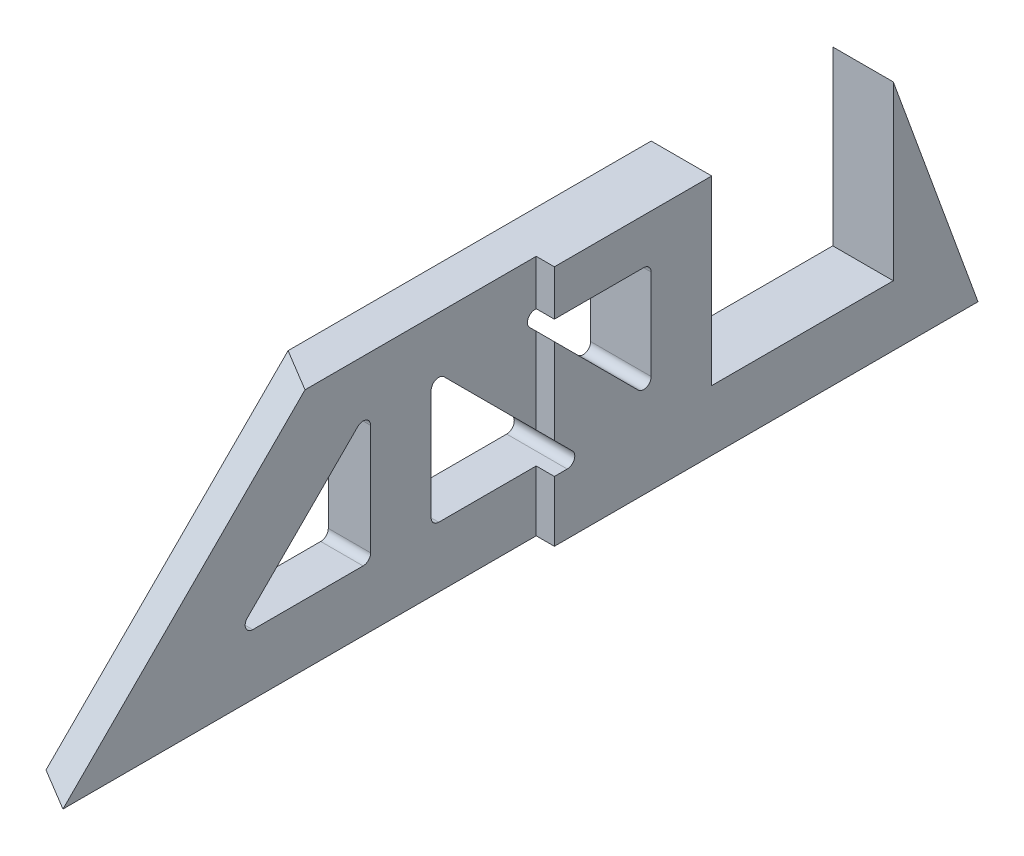
ISO-10303-21;
HEADER;
FILE_DESCRIPTION(('STEP AP214'),'2;1');
FILE_NAME('part.step','',(''),(''),'','','');
FILE_SCHEMA(('AUTOMOTIVE_DESIGN { 1 0 10303 214 1 1 1 1 }'));
ENDSEC;
DATA;
#1=APPLICATION_CONTEXT('core data for automotive mechanical design processes');
#2=APPLICATION_PROTOCOL_DEFINITION('international standard','automotive_design',2000,#1);
#3=PRODUCT_CONTEXT('',#1,'mechanical');
#4=PRODUCT('Part','Part','',(#3));
#5=PRODUCT_RELATED_PRODUCT_CATEGORY('part','',(#4));
#6=PRODUCT_DEFINITION_FORMATION('','',#4);
#7=PRODUCT_DEFINITION_CONTEXT('part definition',#1,'design');
#8=PRODUCT_DEFINITION('design','',#6,#7);
#9=PRODUCT_DEFINITION_SHAPE('','',#8);
#10=(LENGTH_UNIT() NAMED_UNIT(*) SI_UNIT(.MILLI.,.METRE.));
#11=(NAMED_UNIT(*) PLANE_ANGLE_UNIT() SI_UNIT($,.RADIAN.));
#12=(NAMED_UNIT(*) SI_UNIT($,.STERADIAN.) SOLID_ANGLE_UNIT());
#13=UNCERTAINTY_MEASURE_WITH_UNIT(LENGTH_MEASURE(1.E-05),#10,'distance_accuracy_value','');
#14=(GEOMETRIC_REPRESENTATION_CONTEXT(3) GLOBAL_UNCERTAINTY_ASSIGNED_CONTEXT((#13)) GLOBAL_UNIT_ASSIGNED_CONTEXT((#10,
#11,#12)) REPRESENTATION_CONTEXT('',''));
#15=CARTESIAN_POINT('',(0.,0.,0.));
#16=DIRECTION('',(0.,0.,1.));
#17=DIRECTION('',(1.,0.,0.));
#18=AXIS2_PLACEMENT_3D('',#15,#16,#17);
#19=CARTESIAN_POINT('',(8.89,0.,-6.34999999999998));
#20=DIRECTION('',(0.,0.,-1.));
#21=DIRECTION('',(0.,1.,0.));
#22=AXIS2_PLACEMENT_3D('',#19,#20,#21);
#23=PLANE('',#22);
#24=DIRECTION('',(0.,1.,0.));
#25=VECTOR('',#24,1.);
#26=CARTESIAN_POINT('',(8.89,0.,-6.34999999999998));
#27=LINE('',#26,#25);
#28=CARTESIAN_POINT('',(8.89,41.275,-6.34999999999998));
#29=VERTEX_POINT('',#28);
#30=CARTESIAN_POINT('',(8.89,50.8,-6.34999999999998));
#31=VERTEX_POINT('',#30);
#32=EDGE_CURVE('E464',#29,#31,#27,.T.);
#33=ORIENTED_EDGE('',*,*,#32,.F.);
#34=DIRECTION('',(-1.,0.,0.));
#35=VECTOR('',#34,1.);
#36=CARTESIAN_POINT('',(12.701,41.275,-6.34999999999998));
#37=LINE('',#36,#35);
#38=CARTESIAN_POINT('',(12.7,41.275,-6.34999999999998));
#39=VERTEX_POINT('',#38);
#40=EDGE_CURVE('E426',#39,#29,#37,.T.);
#41=ORIENTED_EDGE('',*,*,#40,.F.);
#42=DIRECTION('',(0.,1.,0.));
#43=VECTOR('',#42,1.);
#44=CARTESIAN_POINT('',(12.7,0.,-6.34999999999998));
#45=LINE('',#44,#43);
#46=CARTESIAN_POINT('',(12.7,50.8,-6.34999999999998));
#47=VERTEX_POINT('',#46);
#48=EDGE_CURVE('E265',#39,#47,#45,.T.);
#49=ORIENTED_EDGE('',*,*,#48,.T.);
#50=DIRECTION('',(1.,0.,0.));
#51=VECTOR('',#50,1.);
#52=CARTESIAN_POINT('',(8.89,50.8,-6.34999999999998));
#53=LINE('',#52,#51);
#54=EDGE_CURVE('E274',#31,#47,#53,.T.);
#55=ORIENTED_EDGE('',*,*,#54,.F.);
#56=EDGE_LOOP('',(#33,#41,#49,#55));
#57=FACE_BOUND('',#56,.T.);
#58=ADVANCED_FACE('F34',(#57),#23,.F.);
#59=CARTESIAN_POINT('',(12.7,19.2305122421383,-6.34999999999998));
#60=VERTEX_POINT('',#59);
#61=CARTESIAN_POINT('',(12.7,37.1910244842766,-6.34999999999998));
#62=VERTEX_POINT('',#61);
#63=EDGE_CURVE('E242',#60,#62,#45,.T.);
#64=ORIENTED_EDGE('',*,*,#63,.T.);
#65=DIRECTION('',(1.,0.,0.));
#66=VECTOR('',#65,1.);
#67=CARTESIAN_POINT('',(12.701,37.1910244842766,-6.34999999999998));
#68=LINE('',#67,#66);
#69=CARTESIAN_POINT('',(8.89,37.1910244842766,-6.34999999999998));
#70=VERTEX_POINT('',#69);
#71=EDGE_CURVE('E252',#70,#62,#68,.T.);
#72=ORIENTED_EDGE('',*,*,#71,.F.);
#73=CARTESIAN_POINT('',(8.89,19.2305122421383,-6.34999999999998));
#74=VERTEX_POINT('',#73);
#75=EDGE_CURVE('E468',#74,#70,#27,.T.);
#76=ORIENTED_EDGE('',*,*,#75,.F.);
#77=DIRECTION('',(-1.,0.,0.));
#78=VECTOR('',#77,1.);
#79=CARTESIAN_POINT('',(12.701,19.2305122421383,-6.34999999999998));
#80=LINE('',#79,#78);
#81=EDGE_CURVE('E263',#60,#74,#80,.T.);
#82=ORIENTED_EDGE('',*,*,#81,.F.);
#83=EDGE_LOOP('',(#64,#72,#76,#82));
#84=FACE_BOUND('',#83,.T.);
#85=ADVANCED_FACE('F262',(#84),#23,.F.);
#86=CARTESIAN_POINT('',(12.7,50.8,0.));
#87=DIRECTION('',(0.,1.,0.));
#88=DIRECTION('',(0.,0.,1.));
#89=AXIS2_PLACEMENT_3D('',#86,#87,#88);
#90=PLANE('',#89);
#91=ORIENTED_EDGE('',*,*,#54,.T.);
#92=DIRECTION('',(0.,0.,-1.));
#93=VECTOR('',#92,1.);
#94=CARTESIAN_POINT('',(12.7,50.8,0.));
#95=LINE('',#94,#93);
#96=CARTESIAN_POINT('',(12.7,50.8,-39.37));
#97=VERTEX_POINT('',#96);
#98=EDGE_CURVE('E285',#47,#97,#95,.T.);
#99=ORIENTED_EDGE('',*,*,#98,.T.);
#100=DIRECTION('',(-1.,0.,0.));
#101=VECTOR('',#100,1.);
#102=CARTESIAN_POINT('',(12.7,50.8,-39.37));
#103=LINE('',#102,#101);
#104=CARTESIAN_POINT('',(0.,50.8,-39.37));
#105=VERTEX_POINT('',#104);
#106=EDGE_CURVE('E302',#97,#105,#103,.T.);
#107=ORIENTED_EDGE('',*,*,#106,.T.);
#108=DIRECTION('',(0.,0.,-1.));
#109=VECTOR('',#108,1.);
#110=CARTESIAN_POINT('',(0.,50.8,0.));
#111=LINE('',#110,#109);
#112=CARTESIAN_POINT('',(0.,50.8,36.8299999999995));
#113=VERTEX_POINT('',#112);
#114=EDGE_CURVE('E284',#113,#105,#111,.T.);
#115=ORIENTED_EDGE('',*,*,#114,.F.);
#116=DIRECTION('',(-0.857492925712544,0.,-0.514495755427527));
#117=VECTOR('',#116,1.);
#118=CARTESIAN_POINT('',(-6.91029411764683,50.8,32.6838235294114));
#119=LINE('',#118,#117);
#120=CARTESIAN_POINT('',(8.89,50.8,42.1639999999995));
#121=VERTEX_POINT('',#120);
#122=EDGE_CURVE('E282',#121,#113,#119,.T.);
#123=ORIENTED_EDGE('',*,*,#122,.F.);
#124=DIRECTION('',(0.,0.,1.));
#125=VECTOR('',#124,1.);
#126=CARTESIAN_POINT('',(8.89,50.8,0.));
#127=LINE('',#126,#125);
#128=EDGE_CURVE('E268',#31,#121,#127,.T.);
#129=ORIENTED_EDGE('',*,*,#128,.F.);
#130=EDGE_LOOP('',(#91,#99,#107,#115,#123,#129));
#131=FACE_BOUND('',#130,.T.);
#132=ADVANCED_FACE('F534',(#131),#90,.T.);
#133=CARTESIAN_POINT('',(12.7,0.,0.));
#134=DIRECTION('',(0.,1.,0.));
#135=DIRECTION('',(0.,0.,1.));
#136=AXIS2_PLACEMENT_3D('',#133,#134,#135);
#137=PLANE('',#136);
#138=DIRECTION('',(0.,0.,-1.));
#139=VECTOR('',#138,1.);
#140=CARTESIAN_POINT('',(12.7,0.,0.));
#141=LINE('',#140,#139);
#142=CARTESIAN_POINT('',(12.7,0.,-6.34999999999998));
#143=VERTEX_POINT('',#142);
#144=CARTESIAN_POINT('',(12.7,0.,-95.25));
#145=VERTEX_POINT('',#144);
#146=EDGE_CURVE('E287',#143,#145,#141,.T.);
#147=ORIENTED_EDGE('',*,*,#146,.F.);
#148=DIRECTION('',(1.,0.,0.));
#149=VECTOR('',#148,1.);
#150=CARTESIAN_POINT('',(8.89,0.,-6.34999999999998));
#151=LINE('',#150,#149);
#152=CARTESIAN_POINT('',(8.89,0.,-6.34999999999998));
#153=VERTEX_POINT('',#152);
#154=EDGE_CURVE('E278',#153,#143,#151,.T.);
#155=ORIENTED_EDGE('',*,*,#154,.F.);
#156=DIRECTION('',(0.,0.,1.));
#157=VECTOR('',#156,1.);
#158=CARTESIAN_POINT('',(8.89,0.,0.));
#159=LINE('',#158,#157);
#160=CARTESIAN_POINT('',(8.89,0.,92.964));
#161=VERTEX_POINT('',#160);
#162=EDGE_CURVE('E462',#153,#161,#159,.T.);
#163=ORIENTED_EDGE('',*,*,#162,.T.);
#164=DIRECTION('',(0.857492925712544,0.,0.514495755427527));
#165=VECTOR('',#164,1.);
#166=CARTESIAN_POINT('',(12.7,0.,95.25));
#167=LINE('',#166,#165);
#168=CARTESIAN_POINT('',(0.,0.,87.63));
#169=VERTEX_POINT('',#168);
#170=EDGE_CURVE('E277',#169,#161,#167,.T.);
#171=ORIENTED_EDGE('',*,*,#170,.F.);
#172=DIRECTION('',(0.,0.,-1.));
#173=VECTOR('',#172,1.);
#174=CARTESIAN_POINT('',(0.,0.,0.));
#175=LINE('',#174,#173);
#176=CARTESIAN_POINT('',(0.,0.,-95.25));
#177=VERTEX_POINT('',#176);
#178=EDGE_CURVE('E304',#169,#177,#175,.T.);
#179=ORIENTED_EDGE('',*,*,#178,.T.);
#180=DIRECTION('',(-1.,0.,0.));
#181=VECTOR('',#180,1.);
#182=CARTESIAN_POINT('',(12.7,0.,-95.25));
#183=LINE('',#182,#181);
#184=EDGE_CURVE('E325',#145,#177,#183,.T.);
#185=ORIENTED_EDGE('',*,*,#184,.F.);
#186=EDGE_LOOP('',(#147,#155,#163,#171,#179,#185));
#187=FACE_BOUND('',#186,.T.);
#188=ADVANCED_FACE('F479',(#187),#137,.F.);
#189=CARTESIAN_POINT('',(12.7,30.6127599113217,-84.1078666035411));
#190=DIRECTION('',(0.,0.342020143325673,-0.939692620785907));
#191=DIRECTION('',(0.,0.939692620785907,0.342020143325673));
#192=AXIS2_PLACEMENT_3D('',#189,#190,#191);
#193=PLANE('',#192);
#194=DIRECTION('',(0.,-0.939692620785907,-0.342020143325673));
#195=VECTOR('',#194,1.);
#196=CARTESIAN_POINT('',(0.,30.6127599113217,-84.1078666035411));
#197=LINE('',#196,#195);
#198=CARTESIAN_POINT('',(0.,48.8501485179025,-77.47));
#199=VERTEX_POINT('',#198);
#200=EDGE_CURVE('E306',#199,#177,#197,.T.);
#201=ORIENTED_EDGE('',*,*,#200,.F.);
#202=DIRECTION('',(-1.,0.,0.));
#203=VECTOR('',#202,1.);
#204=CARTESIAN_POINT('',(12.7,48.8501485179025,-77.47));
#205=LINE('',#204,#203);
#206=CARTESIAN_POINT('',(12.7,48.8501485179025,-77.47));
#207=VERTEX_POINT('',#206);
#208=EDGE_CURVE('E323',#207,#199,#205,.T.);
#209=ORIENTED_EDGE('',*,*,#208,.F.);
#210=DIRECTION('',(0.,-0.939692620785907,-0.342020143325673));
#211=VECTOR('',#210,1.);
#212=CARTESIAN_POINT('',(12.7,30.6127599113217,-84.1078666035411));
#213=LINE('',#212,#211);
#214=EDGE_CURVE('E290',#207,#145,#213,.T.);
#215=ORIENTED_EDGE('',*,*,#214,.T.);
#216=ORIENTED_EDGE('',*,*,#184,.T.);
#217=EDGE_LOOP('',(#201,#209,#215,#216));
#218=FACE_BOUND('',#217,.T.);
#219=ADVANCED_FACE('F518',(#218),#193,.T.);
#220=CARTESIAN_POINT('',(12.7,0.,-77.47));
#221=DIRECTION('',(0.,0.,1.));
#222=DIRECTION('',(1.,0.,0.));
#223=AXIS2_PLACEMENT_3D('',#220,#221,#222);
#224=PLANE('',#223);
#225=DIRECTION('',(0.,1.,0.));
#226=VECTOR('',#225,1.);
#227=CARTESIAN_POINT('',(0.,0.,-77.47));
#228=LINE('',#227,#226);
#229=CARTESIAN_POINT('',(0.,12.7,-77.47));
#230=VERTEX_POINT('',#229);
#231=EDGE_CURVE('E309',#230,#199,#228,.T.);
#232=ORIENTED_EDGE('',*,*,#231,.F.);
#233=DIRECTION('',(-1.,0.,0.));
#234=VECTOR('',#233,1.);
#235=CARTESIAN_POINT('',(12.7,12.7,-77.47));
#236=LINE('',#235,#234);
#237=CARTESIAN_POINT('',(12.7,12.7,-77.47));
#238=VERTEX_POINT('',#237);
#239=EDGE_CURVE('E321',#238,#230,#236,.T.);
#240=ORIENTED_EDGE('',*,*,#239,.F.);
#241=DIRECTION('',(0.,1.,0.));
#242=VECTOR('',#241,1.);
#243=CARTESIAN_POINT('',(12.7,0.,-77.47));
#244=LINE('',#243,#242);
#245=EDGE_CURVE('E293',#238,#207,#244,.T.);
#246=ORIENTED_EDGE('',*,*,#245,.T.);
#247=ORIENTED_EDGE('',*,*,#208,.T.);
#248=EDGE_LOOP('',(#232,#240,#246,#247));
#249=FACE_BOUND('',#248,.T.);
#250=ADVANCED_FACE('F521',(#249),#224,.T.);
#251=CARTESIAN_POINT('',(12.7,12.7,0.));
#252=DIRECTION('',(0.,1.,0.));
#253=DIRECTION('',(0.,0.,1.));
#254=AXIS2_PLACEMENT_3D('',#251,#252,#253);
#255=PLANE('',#254);
#256=DIRECTION('',(0.,0.,-1.));
#257=VECTOR('',#256,1.);
#258=CARTESIAN_POINT('',(0.,12.7,0.));
#259=LINE('',#258,#257);
#260=CARTESIAN_POINT('',(0.,12.7,-39.37));
#261=VERTEX_POINT('',#260);
#262=EDGE_CURVE('E312',#261,#230,#259,.T.);
#263=ORIENTED_EDGE('',*,*,#262,.F.);
#264=DIRECTION('',(-1.,0.,0.));
#265=VECTOR('',#264,1.);
#266=CARTESIAN_POINT('',(12.7,12.7,-39.37));
#267=LINE('',#266,#265);
#268=CARTESIAN_POINT('',(12.7,12.7,-39.37));
#269=VERTEX_POINT('',#268);
#270=EDGE_CURVE('E319',#269,#261,#267,.T.);
#271=ORIENTED_EDGE('',*,*,#270,.F.);
#272=DIRECTION('',(0.,0.,-1.));
#273=VECTOR('',#272,1.);
#274=CARTESIAN_POINT('',(12.7,12.7,0.));
#275=LINE('',#274,#273);
#276=EDGE_CURVE('E296',#269,#238,#275,.T.);
#277=ORIENTED_EDGE('',*,*,#276,.T.);
#278=ORIENTED_EDGE('',*,*,#239,.T.);
#279=EDGE_LOOP('',(#263,#271,#277,#278));
#280=FACE_BOUND('',#279,.T.);
#281=ADVANCED_FACE('F526',(#280),#255,.T.);
#282=CARTESIAN_POINT('',(12.7,0.,-39.37));
#283=DIRECTION('',(0.,0.,-1.));
#284=DIRECTION('',(0.,1.,0.));
#285=AXIS2_PLACEMENT_3D('',#282,#283,#284);
#286=PLANE('',#285);
#287=DIRECTION('',(0.,-1.,0.));
#288=VECTOR('',#287,1.);
#289=CARTESIAN_POINT('',(0.,0.,-39.37));
#290=LINE('',#289,#288);
#291=EDGE_CURVE('E288',#105,#261,#290,.T.);
#292=ORIENTED_EDGE('',*,*,#291,.F.);
#293=ORIENTED_EDGE('',*,*,#106,.F.);
#294=DIRECTION('',(0.,-1.,0.));
#295=VECTOR('',#294,1.);
#296=CARTESIAN_POINT('',(12.7,0.,-39.37));
#297=LINE('',#296,#295);
#298=EDGE_CURVE('E299',#97,#269,#297,.T.);
#299=ORIENTED_EDGE('',*,*,#298,.T.);
#300=ORIENTED_EDGE('',*,*,#270,.T.);
#301=EDGE_LOOP('',(#292,#293,#299,#300));
#302=FACE_BOUND('',#301,.T.);
#303=ADVANCED_FACE('F529',(#302),#286,.T.);
#304=CARTESIAN_POINT('',(12.7,0.,0.));
#305=DIRECTION('',(1.,0.,0.));
#306=DIRECTION('',(0.,0.,-1.));
#307=AXIS2_PLACEMENT_3D('',#304,#305,#306);
#308=PLANE('',#307);
#309=DIRECTION('',(0.,0.,-1.));
#310=VECTOR('',#309,1.);
#311=CARTESIAN_POINT('',(12.7,41.275,-26.67));
#312=LINE('',#311,#310);
#313=CARTESIAN_POINT('',(12.7,41.275,-25.0825));
#314=VERTEX_POINT('',#313);
#315=EDGE_CURVE('E249',#39,#314,#312,.T.);
#316=ORIENTED_EDGE('',*,*,#315,.T.);
#317=CARTESIAN_POINT('',(12.7,39.6875,-25.0825));
#318=DIRECTION('',(1.,0.,0.));
#319=DIRECTION('',(0.,0.,-1.));
#320=AXIS2_PLACEMENT_3D('',#317,#318,#319);
#321=CIRCLE('',#320,1.5875);
#322=CARTESIAN_POINT('',(12.7,39.6875,-26.67));
#323=VERTEX_POINT('',#322);
#324=EDGE_CURVE('E405',#314,#323,#321,.F.);
#325=ORIENTED_EDGE('',*,*,#324,.T.);
#326=DIRECTION('',(0.,-1.,0.));
#327=VECTOR('',#326,1.);
#328=CARTESIAN_POINT('',(12.7,16.8710244842766,-26.67));
#329=LINE('',#328,#327);
#330=CARTESIAN_POINT('',(12.7,20.7035885145438,-26.67));
#331=VERTEX_POINT('',#330);
#332=EDGE_CURVE('E259',#323,#331,#329,.T.);
#333=ORIENTED_EDGE('',*,*,#332,.T.);
#334=CARTESIAN_POINT('',(12.7,20.7035885145438,-25.0825));
#335=DIRECTION('',(1.,0.,0.));
#336=DIRECTION('',(0.,0.,-1.));
#337=AXIS2_PLACEMENT_3D('',#334,#335,#336);
#338=CIRCLE('',#337,1.5875);
#339=CARTESIAN_POINT('',(12.7,19.5810564994102,-23.9599679848664));
#340=VERTEX_POINT('',#339);
#341=EDGE_CURVE('E245',#331,#340,#338,.F.);
#342=ORIENTED_EDGE('',*,*,#341,.T.);
#343=DIRECTION('',(0.,0.707106781186548,0.707106781186547));
#344=VECTOR('',#343,1.);
#345=CARTESIAN_POINT('',(12.7,41.275,-2.26602448427658));
#346=LINE('',#345,#344);
#347=EDGE_CURVE('E237',#340,#62,#346,.T.);
#348=ORIENTED_EDGE('',*,*,#347,.T.);
#349=ORIENTED_EDGE('',*,*,#63,.F.);
#350=DIRECTION('',(0.,-0.707106781186548,-0.707106781186548));
#351=VECTOR('',#350,1.);
#352=CARTESIAN_POINT('',(12.7,12.7,-12.8805122421383));
#353=LINE('',#352,#351);
#354=CARTESIAN_POINT('',(12.7,15.4100320151336,-10.1704802270046));
#355=VERTEX_POINT('',#354);
#356=EDGE_CURVE('E443',#60,#355,#353,.T.);
#357=ORIENTED_EDGE('',*,*,#356,.T.);
#358=CARTESIAN_POINT('',(12.7,14.2875,-9.04794821187098));
#359=DIRECTION('',(1.,0.,0.));
#360=DIRECTION('',(0.,0.,-1.));
#361=AXIS2_PLACEMENT_3D('',#358,#359,#360);
#362=CIRCLE('',#361,1.5875);
#363=CARTESIAN_POINT('',(12.7,12.7,-9.04794821187098));
#364=VERTEX_POINT('',#363);
#365=EDGE_CURVE('E399',#355,#364,#362,.F.);
#366=ORIENTED_EDGE('',*,*,#365,.T.);
#367=DIRECTION('',(0.,0.,1.));
#368=VECTOR('',#367,1.);
#369=CARTESIAN_POINT('',(12.7,12.7,15.6944877578617));
#370=LINE('',#369,#368);
#371=CARTESIAN_POINT('',(12.7,12.7,-6.34999999999998));
#372=VERTEX_POINT('',#371);
#373=EDGE_CURVE('E459',#364,#372,#370,.T.);
#374=ORIENTED_EDGE('',*,*,#373,.T.);
#375=EDGE_CURVE('E264',#143,#372,#45,.T.);
#376=ORIENTED_EDGE('',*,*,#375,.F.);
#377=ORIENTED_EDGE('',*,*,#146,.T.);
#378=ORIENTED_EDGE('',*,*,#214,.F.);
#379=ORIENTED_EDGE('',*,*,#245,.F.);
#380=ORIENTED_EDGE('',*,*,#276,.F.);
#381=ORIENTED_EDGE('',*,*,#298,.F.);
#382=ORIENTED_EDGE('',*,*,#98,.F.);
#383=ORIENTED_EDGE('',*,*,#48,.F.);
#384=EDGE_LOOP('',(#316,#325,#333,#342,#348,#349,#357,#366,#374,#376,#377,#378,#379,#380,#381,
#382,#383));
#385=FACE_BOUND('',#384,.T.);
#386=ADVANCED_FACE('F239',(#385),#308,.T.);
#387=CARTESIAN_POINT('',(0.,0.,0.));
#388=DIRECTION('',(1.,0.,0.));
#389=DIRECTION('',(0.,0.,-1.));
#390=AXIS2_PLACEMENT_3D('',#387,#388,#389);
#391=PLANE('',#390);
#392=DIRECTION('',(0.,0.707106781186548,-0.707106781186547));
#393=VECTOR('',#392,1.);
#394=CARTESIAN_POINT('',(0.,12.7,56.9694877578617));
#395=LINE('',#394,#393);
#396=CARTESIAN_POINT('',(0.,15.4100320151336,54.2594557427281));
#397=VERTEX_POINT('',#396);
#398=CARTESIAN_POINT('',(0.,38.5649679848663,31.1045197729954));
#399=VERTEX_POINT('',#398);
#400=EDGE_CURVE('E598',#397,#399,#395,.T.);
#401=ORIENTED_EDGE('',*,*,#400,.F.);
#402=CARTESIAN_POINT('',(0.,14.2875,53.1369237275944));
#403=DIRECTION('',(1.,0.,0.));
#404=DIRECTION('',(0.,0.,-1.));
#405=AXIS2_PLACEMENT_3D('',#402,#403,#404);
#406=CIRCLE('',#405,1.5875);
#407=CARTESIAN_POINT('',(0.,12.7,53.1369237275944));
#408=VERTEX_POINT('',#407);
#409=EDGE_CURVE('E377',#397,#408,#406,.T.);
#410=ORIENTED_EDGE('',*,*,#409,.T.);
#411=DIRECTION('',(0.,0.,1.));
#412=VECTOR('',#411,1.);
#413=CARTESIAN_POINT('',(0.,12.7,28.3944877578617));
#414=LINE('',#413,#412);
#415=CARTESIAN_POINT('',(0.,12.7,29.9819877578617));
#416=VERTEX_POINT('',#415);
#417=EDGE_CURVE('E603',#416,#408,#414,.T.);
#418=ORIENTED_EDGE('',*,*,#417,.F.);
#419=CARTESIAN_POINT('',(0.,14.2875,29.9819877578617));
#420=DIRECTION('',(1.,0.,0.));
#421=DIRECTION('',(0.,0.,-1.));
#422=AXIS2_PLACEMENT_3D('',#419,#420,#421);
#423=CIRCLE('',#422,1.5875);
#424=CARTESIAN_POINT('',(0.,14.2875,28.3944877578617));
#425=VERTEX_POINT('',#424);
#426=EDGE_CURVE('E393',#416,#425,#423,.T.);
#427=ORIENTED_EDGE('',*,*,#426,.T.);
#428=DIRECTION('',(0.,-1.,0.));
#429=VECTOR('',#428,1.);
#430=CARTESIAN_POINT('',(0.,41.275,28.3944877578617));
#431=LINE('',#430,#429);
#432=CARTESIAN_POINT('',(0.,37.4424359697327,28.3944877578617));
#433=VERTEX_POINT('',#432);
#434=EDGE_CURVE('E599',#433,#425,#431,.T.);
#435=ORIENTED_EDGE('',*,*,#434,.F.);
#436=CARTESIAN_POINT('',(0.,37.4424359697327,29.9819877578617));
#437=DIRECTION('',(1.,0.,0.));
#438=DIRECTION('',(0.,0.,-1.));
#439=AXIS2_PLACEMENT_3D('',#436,#437,#438);
#440=CIRCLE('',#439,1.5875);
#441=EDGE_CURVE('E389',#433,#399,#440,.T.);
#442=ORIENTED_EDGE('',*,*,#441,.T.);
#443=EDGE_LOOP('',(#401,#410,#418,#427,#435,#442));
#444=FACE_BOUND('',#443,.T.);
#445=DIRECTION('',(0.,-1.,0.));
#446=VECTOR('',#445,1.);
#447=CARTESIAN_POINT('',(0.,16.8710244842766,-26.67));
#448=LINE('',#447,#446);
#449=CARTESIAN_POINT('',(0.,39.6875,-26.67));
#450=VERTEX_POINT('',#449);
#451=CARTESIAN_POINT('',(0.,20.7035885145438,-26.67));
#452=VERTEX_POINT('',#451);
#453=EDGE_CURVE('E415',#450,#452,#448,.T.);
#454=ORIENTED_EDGE('',*,*,#453,.F.);
#455=CARTESIAN_POINT('',(0.,39.6875,-25.0825));
#456=DIRECTION('',(1.,0.,0.));
#457=DIRECTION('',(0.,0.,-1.));
#458=AXIS2_PLACEMENT_3D('',#455,#456,#457);
#459=CIRCLE('',#458,1.5875);
#460=CARTESIAN_POINT('',(0.,41.275,-25.0825));
#461=VERTEX_POINT('',#460);
#462=EDGE_CURVE('E57',#450,#461,#459,.T.);
#463=ORIENTED_EDGE('',*,*,#462,.T.);
#464=DIRECTION('',(0.,0.,-1.));
#465=VECTOR('',#464,1.);
#466=CARTESIAN_POINT('',(0.,41.275,-26.67));
#467=LINE('',#466,#465);
#468=CARTESIAN_POINT('',(0.,41.275,-6.09858851454387));
#469=VERTEX_POINT('',#468);
#470=EDGE_CURVE('E411',#469,#461,#467,.T.);
#471=ORIENTED_EDGE('',*,*,#470,.F.);
#472=CARTESIAN_POINT('',(0.,39.6875,-6.09858851454387));
#473=DIRECTION('',(1.,0.,0.));
#474=DIRECTION('',(0.,0.,-1.));
#475=AXIS2_PLACEMENT_3D('',#472,#473,#474);
#476=CIRCLE('',#475,1.5875);
#477=CARTESIAN_POINT('',(0.,38.5649679848663,-4.97605649941023));
#478=VERTEX_POINT('',#477);
#479=EDGE_CURVE('E42',#469,#478,#476,.T.);
#480=ORIENTED_EDGE('',*,*,#479,.T.);
#481=DIRECTION('',(0.,0.707106781186548,0.707106781186548));
#482=VECTOR('',#481,1.);
#483=CARTESIAN_POINT('',(0.,41.275,-2.26602448427658));
#484=LINE('',#483,#482);
#485=CARTESIAN_POINT('',(0.,19.5810564994102,-23.9599679848664));
#486=VERTEX_POINT('',#485);
#487=EDGE_CURVE('E410',#486,#478,#484,.T.);
#488=ORIENTED_EDGE('',*,*,#487,.F.);
#489=CARTESIAN_POINT('',(0.,20.7035885145438,-25.0825));
#490=DIRECTION('',(1.,0.,0.));
#491=DIRECTION('',(0.,0.,-1.));
#492=AXIS2_PLACEMENT_3D('',#489,#490,#491);
#493=CIRCLE('',#492,1.5875);
#494=EDGE_CURVE('E401',#486,#452,#493,.T.);
#495=ORIENTED_EDGE('',*,*,#494,.T.);
#496=EDGE_LOOP('',(#454,#463,#471,#480,#488,#495));
#497=FACE_BOUND('',#496,.T.);
#498=DIRECTION('',(0.,-0.707106781186547,-0.707106781186547));
#499=VECTOR('',#498,1.);
#500=CARTESIAN_POINT('',(0.,12.7,-12.8805122421383));
#501=LINE('',#500,#499);
#502=CARTESIAN_POINT('',(0.,38.5649679848663,12.9844557427281));
#503=VERTEX_POINT('',#502);
#504=CARTESIAN_POINT('',(0.,15.4100320151336,-10.1704802270046));
#505=VERTEX_POINT('',#504);
#506=EDGE_CURVE('E445',#503,#505,#501,.T.);
#507=ORIENTED_EDGE('',*,*,#506,.F.);
#508=CARTESIAN_POINT('',(0.,37.4424359697327,14.1069877578617));
#509=DIRECTION('',(1.,0.,0.));
#510=DIRECTION('',(0.,0.,-1.));
#511=AXIS2_PLACEMENT_3D('',#508,#509,#510);
#512=CIRCLE('',#511,1.5875);
#513=CARTESIAN_POINT('',(0.,37.4424359697327,15.6944877578617));
#514=VERTEX_POINT('',#513);
#515=EDGE_CURVE('E385',#503,#514,#512,.T.);
#516=ORIENTED_EDGE('',*,*,#515,.T.);
#517=DIRECTION('',(0.,1.,0.));
#518=VECTOR('',#517,1.);
#519=CARTESIAN_POINT('',(0.,41.275,15.6944877578617));
#520=LINE('',#519,#518);
#521=CARTESIAN_POINT('',(0.,14.2875,15.6944877578617));
#522=VERTEX_POINT('',#521);
#523=EDGE_CURVE('E451',#522,#514,#520,.T.);
#524=ORIENTED_EDGE('',*,*,#523,.F.);
#525=CARTESIAN_POINT('',(0.,14.2875,14.1069877578617));
#526=DIRECTION('',(1.,0.,0.));
#527=DIRECTION('',(0.,0.,-1.));
#528=AXIS2_PLACEMENT_3D('',#525,#526,#527);
#529=CIRCLE('',#528,1.5875);
#530=CARTESIAN_POINT('',(0.,12.7,14.1069877578617));
#531=VERTEX_POINT('',#530);
#532=EDGE_CURVE('E381',#522,#531,#529,.T.);
#533=ORIENTED_EDGE('',*,*,#532,.T.);
#534=DIRECTION('',(0.,0.,1.));
#535=VECTOR('',#534,1.);
#536=CARTESIAN_POINT('',(0.,12.7,15.6944877578617));
#537=LINE('',#536,#535);
#538=CARTESIAN_POINT('',(0.,12.7,-9.04794821187098));
#539=VERTEX_POINT('',#538);
#540=EDGE_CURVE('E448',#539,#531,#537,.T.);
#541=ORIENTED_EDGE('',*,*,#540,.F.);
#542=CARTESIAN_POINT('',(0.,14.2875,-9.04794821187098));
#543=DIRECTION('',(1.,0.,0.));
#544=DIRECTION('',(0.,0.,-1.));
#545=AXIS2_PLACEMENT_3D('',#542,#543,#544);
#546=CIRCLE('',#545,1.5875);
#547=EDGE_CURVE('E397',#539,#505,#546,.T.);
#548=ORIENTED_EDGE('',*,*,#547,.T.);
#549=EDGE_LOOP('',(#507,#516,#524,#533,#541,#548));
#550=FACE_BOUND('',#549,.T.);
#551=ORIENTED_EDGE('',*,*,#178,.F.);
#552=DIRECTION('',(0.,0.707106781186544,-0.707106781186551));
#553=VECTOR('',#552,1.);
#554=CARTESIAN_POINT('',(0.,43.815,43.8149999999995));
#555=LINE('',#554,#553);
#556=EDGE_CURVE('E328',#169,#113,#555,.T.);
#557=ORIENTED_EDGE('',*,*,#556,.T.);
#558=ORIENTED_EDGE('',*,*,#114,.T.);
#559=ORIENTED_EDGE('',*,*,#291,.T.);
#560=ORIENTED_EDGE('',*,*,#262,.T.);
#561=ORIENTED_EDGE('',*,*,#231,.T.);
#562=ORIENTED_EDGE('',*,*,#200,.T.);
#563=EDGE_LOOP('',(#551,#557,#558,#559,#560,#561,#562));
#564=FACE_BOUND('',#563,.T.);
#565=ADVANCED_FACE('F408',(#444,#497,#550,#564),#391,.F.);
#566=CARTESIAN_POINT('',(12.7,120.65,-25.400000000001));
#567=DIRECTION('',(0.39056673294247,-0.650944554904123,-0.650944554904116));
#568=DIRECTION('',(0.,0.707106781186544,-0.707106781186551));
#569=AXIS2_PLACEMENT_3D('',#566,#567,#568);
#570=PLANE('',#569);
#571=ORIENTED_EDGE('',*,*,#170,.T.);
#572=DIRECTION('',(0.,0.707106781186544,-0.707106781186551));
#573=VECTOR('',#572,1.);
#574=CARTESIAN_POINT('',(8.89,119.507,-26.543000000001));
#575=LINE('',#574,#573);
#576=EDGE_CURVE('E331',#161,#121,#575,.T.);
#577=ORIENTED_EDGE('',*,*,#576,.T.);
#578=ORIENTED_EDGE('',*,*,#122,.T.);
#579=ORIENTED_EDGE('',*,*,#556,.F.);
#580=EDGE_LOOP('',(#571,#577,#578,#579));
#581=FACE_BOUND('',#580,.T.);
#582=ADVANCED_FACE('F511',(#581),#570,.F.);
#583=CARTESIAN_POINT('',(8.89,0.,0.));
#584=DIRECTION('',(-1.,0.,0.));
#585=DIRECTION('',(0.,0.,1.));
#586=AXIS2_PLACEMENT_3D('',#583,#584,#585);
#587=PLANE('',#586);
#588=DIRECTION('',(0.,1.,0.));
#589=VECTOR('',#588,1.);
#590=CARTESIAN_POINT('',(8.89,41.275,28.3944877578617));
#591=LINE('',#590,#589);
#592=CARTESIAN_POINT('',(8.89,14.2875,28.3944877578617));
#593=VERTEX_POINT('',#592);
#594=CARTESIAN_POINT('',(8.89,37.4424359697327,28.3944877578617));
#595=VERTEX_POINT('',#594);
#596=EDGE_CURVE('E461',#593,#595,#591,.T.);
#597=ORIENTED_EDGE('',*,*,#596,.F.);
#598=CARTESIAN_POINT('',(8.89,14.2875,29.9819877578617));
#599=DIRECTION('',(-1.,0.,0.));
#600=DIRECTION('',(0.,0.,1.));
#601=AXIS2_PLACEMENT_3D('',#598,#599,#600);
#602=CIRCLE('',#601,1.5875);
#603=CARTESIAN_POINT('',(8.89,12.7,29.9819877578617));
#604=VERTEX_POINT('',#603);
#605=EDGE_CURVE('E395',#593,#604,#602,.T.);
#606=ORIENTED_EDGE('',*,*,#605,.T.);
#607=DIRECTION('',(0.,0.,-1.));
#608=VECTOR('',#607,1.);
#609=CARTESIAN_POINT('',(8.89,12.7,28.3944877578617));
#610=LINE('',#609,#608);
#611=CARTESIAN_POINT('',(8.89,12.7,53.1369237275944));
#612=VERTEX_POINT('',#611);
#613=EDGE_CURVE('E590',#612,#604,#610,.T.);
#614=ORIENTED_EDGE('',*,*,#613,.F.);
#615=CARTESIAN_POINT('',(8.89,14.2875,53.1369237275944));
#616=DIRECTION('',(-1.,0.,0.));
#617=DIRECTION('',(0.,0.,1.));
#618=AXIS2_PLACEMENT_3D('',#615,#616,#617);
#619=CIRCLE('',#618,1.5875);
#620=CARTESIAN_POINT('',(8.89,15.4100320151336,54.2594557427281));
#621=VERTEX_POINT('',#620);
#622=EDGE_CURVE('E379',#612,#621,#619,.T.);
#623=ORIENTED_EDGE('',*,*,#622,.T.);
#624=DIRECTION('',(0.,-0.707106781186548,0.707106781186547));
#625=VECTOR('',#624,1.);
#626=CARTESIAN_POINT('',(8.89,12.7,56.9694877578617));
#627=LINE('',#626,#625);
#628=CARTESIAN_POINT('',(8.89,38.5649679848663,31.1045197729954));
#629=VERTEX_POINT('',#628);
#630=EDGE_CURVE('E269',#629,#621,#627,.T.);
#631=ORIENTED_EDGE('',*,*,#630,.F.);
#632=CARTESIAN_POINT('',(8.89,37.4424359697327,29.9819877578617));
#633=DIRECTION('',(-1.,0.,0.));
#634=DIRECTION('',(0.,0.,1.));
#635=AXIS2_PLACEMENT_3D('',#632,#633,#634);
#636=CIRCLE('',#635,1.5875);
#637=EDGE_CURVE('E391',#629,#595,#636,.T.);
#638=ORIENTED_EDGE('',*,*,#637,.T.);
#639=EDGE_LOOP('',(#597,#606,#614,#623,#631,#638));
#640=FACE_BOUND('',#639,.T.);
#641=DIRECTION('',(0.,-0.707106781186548,-0.707106781186547));
#642=VECTOR('',#641,1.);
#643=CARTESIAN_POINT('',(8.89,41.275,-2.26602448427658));
#644=LINE('',#643,#642);
#645=CARTESIAN_POINT('',(8.89,38.5649679848663,-4.97605649941023));
#646=VERTEX_POINT('',#645);
#647=EDGE_CURVE('E255',#646,#70,#644,.T.);
#648=ORIENTED_EDGE('',*,*,#647,.F.);
#649=CARTESIAN_POINT('',(8.89,39.6875,-6.09858851454387));
#650=DIRECTION('',(-1.,0.,0.));
#651=DIRECTION('',(0.,0.,1.));
#652=AXIS2_PLACEMENT_3D('',#649,#650,#651);
#653=CIRCLE('',#652,1.5875);
#654=CARTESIAN_POINT('',(8.89,41.275,-6.09858851454387));
#655=VERTEX_POINT('',#654);
#656=EDGE_CURVE('E11',#646,#655,#653,.T.);
#657=ORIENTED_EDGE('',*,*,#656,.T.);
#658=DIRECTION('',(0.,0.,1.));
#659=VECTOR('',#658,1.);
#660=CARTESIAN_POINT('',(8.89,41.275,-26.67));
#661=LINE('',#660,#659);
#662=EDGE_CURVE('E422',#29,#655,#661,.T.);
#663=ORIENTED_EDGE('',*,*,#662,.F.);
#664=ORIENTED_EDGE('',*,*,#32,.T.);
#665=ORIENTED_EDGE('',*,*,#128,.T.);
#666=ORIENTED_EDGE('',*,*,#576,.F.);
#667=ORIENTED_EDGE('',*,*,#162,.F.);
#668=CARTESIAN_POINT('',(8.89,12.7,-6.34999999999998));
#669=VERTEX_POINT('',#668);
#670=EDGE_CURVE('E272',#153,#669,#27,.T.);
#671=ORIENTED_EDGE('',*,*,#670,.T.);
#672=DIRECTION('',(0.,0.,-1.));
#673=VECTOR('',#672,1.);
#674=CARTESIAN_POINT('',(8.89,12.7,15.6944877578617));
#675=LINE('',#674,#673);
#676=CARTESIAN_POINT('',(8.89,12.7,14.1069877578617));
#677=VERTEX_POINT('',#676);
#678=EDGE_CURVE('E457',#677,#669,#675,.T.);
#679=ORIENTED_EDGE('',*,*,#678,.F.);
#680=CARTESIAN_POINT('',(8.89,14.2875,14.1069877578617));
#681=DIRECTION('',(-1.,0.,0.));
#682=DIRECTION('',(0.,0.,1.));
#683=AXIS2_PLACEMENT_3D('',#680,#681,#682);
#684=CIRCLE('',#683,1.5875);
#685=CARTESIAN_POINT('',(8.89,14.2875,15.6944877578617));
#686=VERTEX_POINT('',#685);
#687=EDGE_CURVE('E383',#677,#686,#684,.T.);
#688=ORIENTED_EDGE('',*,*,#687,.T.);
#689=DIRECTION('',(0.,-1.,0.));
#690=VECTOR('',#689,1.);
#691=CARTESIAN_POINT('',(8.89,41.275,15.6944877578617));
#692=LINE('',#691,#690);
#693=CARTESIAN_POINT('',(8.89,37.4424359697327,15.6944877578617));
#694=VERTEX_POINT('',#693);
#695=EDGE_CURVE('E437',#694,#686,#692,.T.);
#696=ORIENTED_EDGE('',*,*,#695,.F.);
#697=CARTESIAN_POINT('',(8.89,37.4424359697327,14.1069877578617));
#698=DIRECTION('',(-1.,0.,0.));
#699=DIRECTION('',(0.,0.,1.));
#700=AXIS2_PLACEMENT_3D('',#697,#698,#699);
#701=CIRCLE('',#700,1.5875);
#702=CARTESIAN_POINT('',(8.89,38.5649679848663,12.9844557427281));
#703=VERTEX_POINT('',#702);
#704=EDGE_CURVE('E387',#694,#703,#701,.T.);
#705=ORIENTED_EDGE('',*,*,#704,.T.);
#706=DIRECTION('',(0.,0.707106781186548,0.707106781186548));
#707=VECTOR('',#706,1.);
#708=CARTESIAN_POINT('',(8.89,12.7,-12.8805122421383));
#709=LINE('',#708,#707);
#710=EDGE_CURVE('E440',#74,#703,#709,.T.);
#711=ORIENTED_EDGE('',*,*,#710,.F.);
#712=ORIENTED_EDGE('',*,*,#75,.T.);
#713=EDGE_LOOP('',(#648,#657,#663,#664,#665,#666,#667,#671,#679,#688,#696,#705,#711,#712));
#714=FACE_BOUND('',#713,.T.);
#715=ADVANCED_FACE('F421',(#640,#714),#587,.F.);
#716=ORIENTED_EDGE('',*,*,#375,.T.);
#717=DIRECTION('',(1.,0.,0.));
#718=VECTOR('',#717,1.);
#719=CARTESIAN_POINT('',(12.701,12.7,-6.34999999999998));
#720=LINE('',#719,#718);
#721=EDGE_CURVE('E454',#669,#372,#720,.T.);
#722=ORIENTED_EDGE('',*,*,#721,.F.);
#723=ORIENTED_EDGE('',*,*,#670,.F.);
#724=ORIENTED_EDGE('',*,*,#154,.T.);
#725=EDGE_LOOP('',(#716,#722,#723,#724));
#726=FACE_BOUND('',#725,.T.);
#727=ADVANCED_FACE('F476',(#726),#23,.F.);
#728=CARTESIAN_POINT('',(12.701,41.275,15.6944877578617));
#729=DIRECTION('',(0.,0.,1.));
#730=DIRECTION('',(0.,-1.,0.));
#731=AXIS2_PLACEMENT_3D('',#728,#729,#730);
#732=PLANE('',#731);
#733=ORIENTED_EDGE('',*,*,#695,.T.);
#734=DIRECTION('',(-1.,0.,0.));
#735=VECTOR('',#734,1.);
#736=CARTESIAN_POINT('',(0.,14.2875,15.6944877578617));
#737=LINE('',#736,#735);
#738=EDGE_CURVE('E346',#686,#522,#737,.T.);
#739=ORIENTED_EDGE('',*,*,#738,.T.);
#740=ORIENTED_EDGE('',*,*,#523,.T.);
#741=DIRECTION('',(-1.,0.,0.));
#742=VECTOR('',#741,1.);
#743=CARTESIAN_POINT('',(8.89,37.4424359697327,15.6944877578617));
#744=LINE('',#743,#742);
#745=EDGE_CURVE('E344',#514,#694,#744,.F.);
#746=ORIENTED_EDGE('',*,*,#745,.T.);
#747=EDGE_LOOP('',(#733,#739,#740,#746));
#748=FACE_BOUND('',#747,.T.);
#749=ADVANCED_FACE('F496',(#748),#732,.F.);
#750=CARTESIAN_POINT('',(12.701,12.7,-12.8805122421383));
#751=DIRECTION('',(0.,0.707106781186548,-0.707106781186548));
#752=DIRECTION('',(0.,0.707106781186548,0.707106781186548));
#753=AXIS2_PLACEMENT_3D('',#750,#751,#752);
#754=PLANE('',#753);
#755=ORIENTED_EDGE('',*,*,#710,.T.);
#756=DIRECTION('',(-1.,0.,0.));
#757=VECTOR('',#756,1.);
#758=CARTESIAN_POINT('',(0.,38.5649679848663,12.9844557427281));
#759=LINE('',#758,#757);
#760=EDGE_CURVE('E356',#703,#503,#759,.T.);
#761=ORIENTED_EDGE('',*,*,#760,.T.);
#762=ORIENTED_EDGE('',*,*,#506,.T.);
#763=DIRECTION('',(-1.,0.,0.));
#764=VECTOR('',#763,1.);
#765=CARTESIAN_POINT('',(12.7,15.4100320151336,-10.1704802270046));
#766=LINE('',#765,#764);
#767=EDGE_CURVE('E354',#505,#355,#766,.F.);
#768=ORIENTED_EDGE('',*,*,#767,.T.);
#769=ORIENTED_EDGE('',*,*,#356,.F.);
#770=ORIENTED_EDGE('',*,*,#81,.T.);
#771=EDGE_LOOP('',(#755,#761,#762,#768,#769,#770));
#772=FACE_BOUND('',#771,.T.);
#773=ADVANCED_FACE('F504',(#772),#754,.F.);
#774=CARTESIAN_POINT('',(12.701,12.7,15.6944877578617));
#775=DIRECTION('',(0.,-1.,0.));
#776=DIRECTION('',(0.,0.,-1.));
#777=AXIS2_PLACEMENT_3D('',#774,#775,#776);
#778=PLANE('',#777);
#779=ORIENTED_EDGE('',*,*,#540,.T.);
#780=DIRECTION('',(-1.,0.,0.));
#781=VECTOR('',#780,1.);
#782=CARTESIAN_POINT('',(8.89,12.7,14.1069877578617));
#783=LINE('',#782,#781);
#784=EDGE_CURVE('E352',#531,#677,#783,.F.);
#785=ORIENTED_EDGE('',*,*,#784,.T.);
#786=ORIENTED_EDGE('',*,*,#678,.T.);
#787=ORIENTED_EDGE('',*,*,#721,.T.);
#788=ORIENTED_EDGE('',*,*,#373,.F.);
#789=DIRECTION('',(-1.,0.,0.));
#790=VECTOR('',#789,1.);
#791=CARTESIAN_POINT('',(0.,12.7,-9.04794821187098));
#792=LINE('',#791,#790);
#793=EDGE_CURVE('E349',#364,#539,#792,.T.);
#794=ORIENTED_EDGE('',*,*,#793,.T.);
#795=EDGE_LOOP('',(#779,#785,#786,#787,#788,#794));
#796=FACE_BOUND('',#795,.T.);
#797=ADVANCED_FACE('F487',(#796),#778,.F.);
#798=CARTESIAN_POINT('',(12.701,41.275,-26.67));
#799=DIRECTION('',(0.,1.,0.));
#800=DIRECTION('',(0.,0.,1.));
#801=AXIS2_PLACEMENT_3D('',#798,#799,#800);
#802=PLANE('',#801);
#803=ORIENTED_EDGE('',*,*,#470,.T.);
#804=DIRECTION('',(-1.,0.,0.));
#805=VECTOR('',#804,1.);
#806=CARTESIAN_POINT('',(12.7,41.275,-25.0825));
#807=LINE('',#806,#805);
#808=EDGE_CURVE('E49',#461,#314,#807,.F.);
#809=ORIENTED_EDGE('',*,*,#808,.T.);
#810=ORIENTED_EDGE('',*,*,#315,.F.);
#811=ORIENTED_EDGE('',*,*,#40,.T.);
#812=ORIENTED_EDGE('',*,*,#662,.T.);
#813=DIRECTION('',(-1.,0.,0.));
#814=VECTOR('',#813,1.);
#815=CARTESIAN_POINT('',(0.,41.275,-6.09858851454387));
#816=LINE('',#815,#814);
#817=EDGE_CURVE('E373',#655,#469,#816,.T.);
#818=ORIENTED_EDGE('',*,*,#817,.T.);
#819=EDGE_LOOP('',(#803,#809,#810,#811,#812,#818));
#820=FACE_BOUND('',#819,.T.);
#821=ADVANCED_FACE('F424',(#820),#802,.F.);
#822=CARTESIAN_POINT('',(12.701,41.275,-2.26602448427658));
#823=DIRECTION('',(0.,-0.707106781186547,0.707106781186548));
#824=DIRECTION('',(0.,-0.707106781186548,-0.707106781186547));
#825=AXIS2_PLACEMENT_3D('',#822,#823,#824);
#826=PLANE('',#825);
#827=ORIENTED_EDGE('',*,*,#347,.F.);
#828=DIRECTION('',(-1.,0.,0.));
#829=VECTOR('',#828,1.);
#830=CARTESIAN_POINT('',(0.,19.5810564994102,-23.9599679848664));
#831=LINE('',#830,#829);
#832=EDGE_CURVE('E366',#340,#486,#831,.T.);
#833=ORIENTED_EDGE('',*,*,#832,.T.);
#834=ORIENTED_EDGE('',*,*,#487,.T.);
#835=DIRECTION('',(-1.,0.,0.));
#836=VECTOR('',#835,1.);
#837=CARTESIAN_POINT('',(8.89,38.5649679848663,-4.97605649941023));
#838=LINE('',#837,#836);
#839=EDGE_CURVE('E364',#478,#646,#838,.F.);
#840=ORIENTED_EDGE('',*,*,#839,.T.);
#841=ORIENTED_EDGE('',*,*,#647,.T.);
#842=ORIENTED_EDGE('',*,*,#71,.T.);
#843=EDGE_LOOP('',(#827,#833,#834,#840,#841,#842));
#844=FACE_BOUND('',#843,.T.);
#845=ADVANCED_FACE('F253',(#844),#826,.F.);
#846=CARTESIAN_POINT('',(12.701,16.8710244842766,-26.67));
#847=DIRECTION('',(0.,0.,-1.));
#848=DIRECTION('',(-1.,0.,0.));
#849=AXIS2_PLACEMENT_3D('',#846,#847,#848);
#850=PLANE('',#849);
#851=ORIENTED_EDGE('',*,*,#453,.T.);
#852=DIRECTION('',(-1.,0.,0.));
#853=VECTOR('',#852,1.);
#854=CARTESIAN_POINT('',(12.7,20.7035885145438,-26.67));
#855=LINE('',#854,#853);
#856=EDGE_CURVE('E371',#452,#331,#855,.F.);
#857=ORIENTED_EDGE('',*,*,#856,.T.);
#858=ORIENTED_EDGE('',*,*,#332,.F.);
#859=DIRECTION('',(-1.,0.,0.));
#860=VECTOR('',#859,1.);
#861=CARTESIAN_POINT('',(0.,39.6875,-26.67));
#862=LINE('',#861,#860);
#863=EDGE_CURVE('E368',#323,#450,#862,.T.);
#864=ORIENTED_EDGE('',*,*,#863,.T.);
#865=EDGE_LOOP('',(#851,#857,#858,#864));
#866=FACE_BOUND('',#865,.T.);
#867=ADVANCED_FACE('F564',(#866),#850,.F.);
#868=CARTESIAN_POINT('',(12.701,12.7,28.3944877578617));
#869=DIRECTION('',(0.,-1.,0.));
#870=DIRECTION('',(0.,0.,-1.));
#871=AXIS2_PLACEMENT_3D('',#868,#869,#870);
#872=PLANE('',#871);
#873=ORIENTED_EDGE('',*,*,#417,.T.);
#874=DIRECTION('',(-1.,0.,0.));
#875=VECTOR('',#874,1.);
#876=CARTESIAN_POINT('',(8.89,12.7,53.1369237275944));
#877=LINE('',#876,#875);
#878=EDGE_CURVE('E342',#408,#612,#877,.F.);
#879=ORIENTED_EDGE('',*,*,#878,.T.);
#880=ORIENTED_EDGE('',*,*,#613,.T.);
#881=DIRECTION('',(-1.,0.,0.));
#882=VECTOR('',#881,1.);
#883=CARTESIAN_POINT('',(0.,12.7,29.9819877578617));
#884=LINE('',#883,#882);
#885=EDGE_CURVE('E339',#604,#416,#884,.T.);
#886=ORIENTED_EDGE('',*,*,#885,.T.);
#887=EDGE_LOOP('',(#873,#879,#880,#886));
#888=FACE_BOUND('',#887,.T.);
#889=ADVANCED_FACE('F567',(#888),#872,.F.);
#890=CARTESIAN_POINT('',(12.701,41.275,28.3944877578617));
#891=DIRECTION('',(0.,0.,-1.));
#892=DIRECTION('',(0.,1.,0.));
#893=AXIS2_PLACEMENT_3D('',#890,#891,#892);
#894=PLANE('',#893);
#895=ORIENTED_EDGE('',*,*,#596,.T.);
#896=DIRECTION('',(-1.,0.,0.));
#897=VECTOR('',#896,1.);
#898=CARTESIAN_POINT('',(0.,37.4424359697327,28.3944877578617));
#899=LINE('',#898,#897);
#900=EDGE_CURVE('E361',#595,#433,#899,.T.);
#901=ORIENTED_EDGE('',*,*,#900,.T.);
#902=ORIENTED_EDGE('',*,*,#434,.T.);
#903=DIRECTION('',(-1.,0.,0.));
#904=VECTOR('',#903,1.);
#905=CARTESIAN_POINT('',(8.89,14.2875,28.3944877578617));
#906=LINE('',#905,#904);
#907=EDGE_CURVE('E359',#425,#593,#906,.F.);
#908=ORIENTED_EDGE('',*,*,#907,.T.);
#909=EDGE_LOOP('',(#895,#901,#902,#908));
#910=FACE_BOUND('',#909,.T.);
#911=ADVANCED_FACE('F573',(#910),#894,.F.);
#912=CARTESIAN_POINT('',(12.701,12.7,56.9694877578617));
#913=DIRECTION('',(0.,0.707106781186547,0.707106781186548));
#914=DIRECTION('',(0.,-0.707106781186548,0.707106781186547));
#915=AXIS2_PLACEMENT_3D('',#912,#913,#914);
#916=PLANE('',#915);
#917=ORIENTED_EDGE('',*,*,#630,.T.);
#918=DIRECTION('',(-1.,0.,0.));
#919=VECTOR('',#918,1.);
#920=CARTESIAN_POINT('',(0.,15.4100320151336,54.2594557427281));
#921=LINE('',#920,#919);
#922=EDGE_CURVE('E336',#621,#397,#921,.T.);
#923=ORIENTED_EDGE('',*,*,#922,.T.);
#924=ORIENTED_EDGE('',*,*,#400,.T.);
#925=DIRECTION('',(-1.,0.,0.));
#926=VECTOR('',#925,1.);
#927=CARTESIAN_POINT('',(8.89,38.5649679848663,31.1045197729954));
#928=LINE('',#927,#926);
#929=EDGE_CURVE('E334',#399,#629,#928,.F.);
#930=ORIENTED_EDGE('',*,*,#929,.T.);
#931=EDGE_LOOP('',(#917,#923,#924,#930));
#932=FACE_BOUND('',#931,.T.);
#933=ADVANCED_FACE('F575',(#932),#916,.F.);
#934=CARTESIAN_POINT('',(12.701,14.2875,53.1369237275944));
#935=DIRECTION('',(1.,0.,0.));
#936=DIRECTION('',(0.,0.,-1.));
#937=AXIS2_PLACEMENT_3D('',#934,#935,#936);
#938=CYLINDRICAL_SURFACE('',#937,1.5875);
#939=ORIENTED_EDGE('',*,*,#622,.F.);
#940=ORIENTED_EDGE('',*,*,#878,.F.);
#941=ORIENTED_EDGE('',*,*,#409,.F.);
#942=ORIENTED_EDGE('',*,*,#922,.F.);
#943=EDGE_LOOP('',(#939,#940,#941,#942));
#944=FACE_BOUND('',#943,.T.);
#945=ADVANCED_FACE('F578',(#944),#938,.F.);
#946=CARTESIAN_POINT('',(12.701,14.2875,14.1069877578617));
#947=DIRECTION('',(1.,0.,0.));
#948=DIRECTION('',(0.,0.,-1.));
#949=AXIS2_PLACEMENT_3D('',#946,#947,#948);
#950=CYLINDRICAL_SURFACE('',#949,1.5875);
#951=ORIENTED_EDGE('',*,*,#687,.F.);
#952=ORIENTED_EDGE('',*,*,#784,.F.);
#953=ORIENTED_EDGE('',*,*,#532,.F.);
#954=ORIENTED_EDGE('',*,*,#738,.F.);
#955=EDGE_LOOP('',(#951,#952,#953,#954));
#956=FACE_BOUND('',#955,.T.);
#957=ADVANCED_FACE('F491',(#956),#950,.F.);
#958=CARTESIAN_POINT('',(12.701,37.4424359697327,14.1069877578617));
#959=DIRECTION('',(1.,0.,0.));
#960=DIRECTION('',(0.,0.,-1.));
#961=AXIS2_PLACEMENT_3D('',#958,#959,#960);
#962=CYLINDRICAL_SURFACE('',#961,1.5875);
#963=ORIENTED_EDGE('',*,*,#704,.F.);
#964=ORIENTED_EDGE('',*,*,#745,.F.);
#965=ORIENTED_EDGE('',*,*,#515,.F.);
#966=ORIENTED_EDGE('',*,*,#760,.F.);
#967=EDGE_LOOP('',(#963,#964,#965,#966));
#968=FACE_BOUND('',#967,.T.);
#969=ADVANCED_FACE('F500',(#968),#962,.F.);
#970=CARTESIAN_POINT('',(12.701,37.4424359697327,29.9819877578617));
#971=DIRECTION('',(1.,0.,0.));
#972=DIRECTION('',(0.,0.,-1.));
#973=AXIS2_PLACEMENT_3D('',#970,#971,#972);
#974=CYLINDRICAL_SURFACE('',#973,1.5875);
#975=ORIENTED_EDGE('',*,*,#637,.F.);
#976=ORIENTED_EDGE('',*,*,#929,.F.);
#977=ORIENTED_EDGE('',*,*,#441,.F.);
#978=ORIENTED_EDGE('',*,*,#900,.F.);
#979=EDGE_LOOP('',(#975,#976,#977,#978));
#980=FACE_BOUND('',#979,.T.);
#981=ADVANCED_FACE('F594',(#980),#974,.F.);
#982=CARTESIAN_POINT('',(12.701,14.2875,29.9819877578617));
#983=DIRECTION('',(1.,0.,0.));
#984=DIRECTION('',(0.,0.,-1.));
#985=AXIS2_PLACEMENT_3D('',#982,#983,#984);
#986=CYLINDRICAL_SURFACE('',#985,1.5875);
#987=ORIENTED_EDGE('',*,*,#605,.F.);
#988=ORIENTED_EDGE('',*,*,#907,.F.);
#989=ORIENTED_EDGE('',*,*,#426,.F.);
#990=ORIENTED_EDGE('',*,*,#885,.F.);
#991=EDGE_LOOP('',(#987,#988,#989,#990));
#992=FACE_BOUND('',#991,.T.);
#993=ADVANCED_FACE('F624',(#992),#986,.F.);
#994=CARTESIAN_POINT('',(12.701,14.2875,-9.04794821187098));
#995=DIRECTION('',(1.,0.,0.));
#996=DIRECTION('',(0.,0.,-1.));
#997=AXIS2_PLACEMENT_3D('',#994,#995,#996);
#998=CYLINDRICAL_SURFACE('',#997,1.5875);
#999=ORIENTED_EDGE('',*,*,#365,.F.);
#1000=ORIENTED_EDGE('',*,*,#767,.F.);
#1001=ORIENTED_EDGE('',*,*,#547,.F.);
#1002=ORIENTED_EDGE('',*,*,#793,.F.);
#1003=EDGE_LOOP('',(#999,#1000,#1001,#1002));
#1004=FACE_BOUND('',#1003,.T.);
#1005=ADVANCED_FACE('F508',(#1004),#998,.F.);
#1006=CARTESIAN_POINT('',(12.701,20.7035885145438,-25.0825));
#1007=DIRECTION('',(1.,0.,0.));
#1008=DIRECTION('',(0.,0.,-1.));
#1009=AXIS2_PLACEMENT_3D('',#1006,#1007,#1008);
#1010=CYLINDRICAL_SURFACE('',#1009,1.5875);
#1011=ORIENTED_EDGE('',*,*,#341,.F.);
#1012=ORIENTED_EDGE('',*,*,#856,.F.);
#1013=ORIENTED_EDGE('',*,*,#494,.F.);
#1014=ORIENTED_EDGE('',*,*,#832,.F.);
#1015=EDGE_LOOP('',(#1011,#1012,#1013,#1014));
#1016=FACE_BOUND('',#1015,.T.);
#1017=ADVANCED_FACE('F617',(#1016),#1010,.F.);
#1018=CARTESIAN_POINT('',(12.701,39.6875,-25.0825));
#1019=DIRECTION('',(1.,0.,0.));
#1020=DIRECTION('',(0.,0.,-1.));
#1021=AXIS2_PLACEMENT_3D('',#1018,#1019,#1020);
#1022=CYLINDRICAL_SURFACE('',#1021,1.5875);
#1023=ORIENTED_EDGE('',*,*,#324,.F.);
#1024=ORIENTED_EDGE('',*,*,#808,.F.);
#1025=ORIENTED_EDGE('',*,*,#462,.F.);
#1026=ORIENTED_EDGE('',*,*,#863,.F.);
#1027=EDGE_LOOP('',(#1023,#1024,#1025,#1026));
#1028=FACE_BOUND('',#1027,.T.);
#1029=ADVANCED_FACE('F614',(#1028),#1022,.F.);
#1030=CARTESIAN_POINT('',(12.701,39.6875,-6.09858851454387));
#1031=DIRECTION('',(1.,0.,0.));
#1032=DIRECTION('',(0.,0.,-1.));
#1033=AXIS2_PLACEMENT_3D('',#1030,#1031,#1032);
#1034=CYLINDRICAL_SURFACE('',#1033,1.5875);
#1035=ORIENTED_EDGE('',*,*,#656,.F.);
#1036=ORIENTED_EDGE('',*,*,#839,.F.);
#1037=ORIENTED_EDGE('',*,*,#479,.F.);
#1038=ORIENTED_EDGE('',*,*,#817,.F.);
#1039=EDGE_LOOP('',(#1035,#1036,#1037,#1038));
#1040=FACE_BOUND('',#1039,.T.);
#1041=ADVANCED_FACE('F36',(#1040),#1034,.F.);
#1042=CLOSED_SHELL('',(#58,#85,#132,#188,#219,#250,#281,#303,#386,#565,#582,#715,#727,#749,#773,
#797,#821,#845,#867,#889,#911,#933,#945,#957,#969,#981,#993,#1005,#1017,#1029,#1041));
#1043=MANIFOLD_SOLID_BREP('B2',#1042);
#1044=ADVANCED_BREP_SHAPE_REPRESENTATION('',(#18,#1043),#14);
#1045=SHAPE_DEFINITION_REPRESENTATION(#9,#1044);
ENDSEC;
END-ISO-10303-21;
